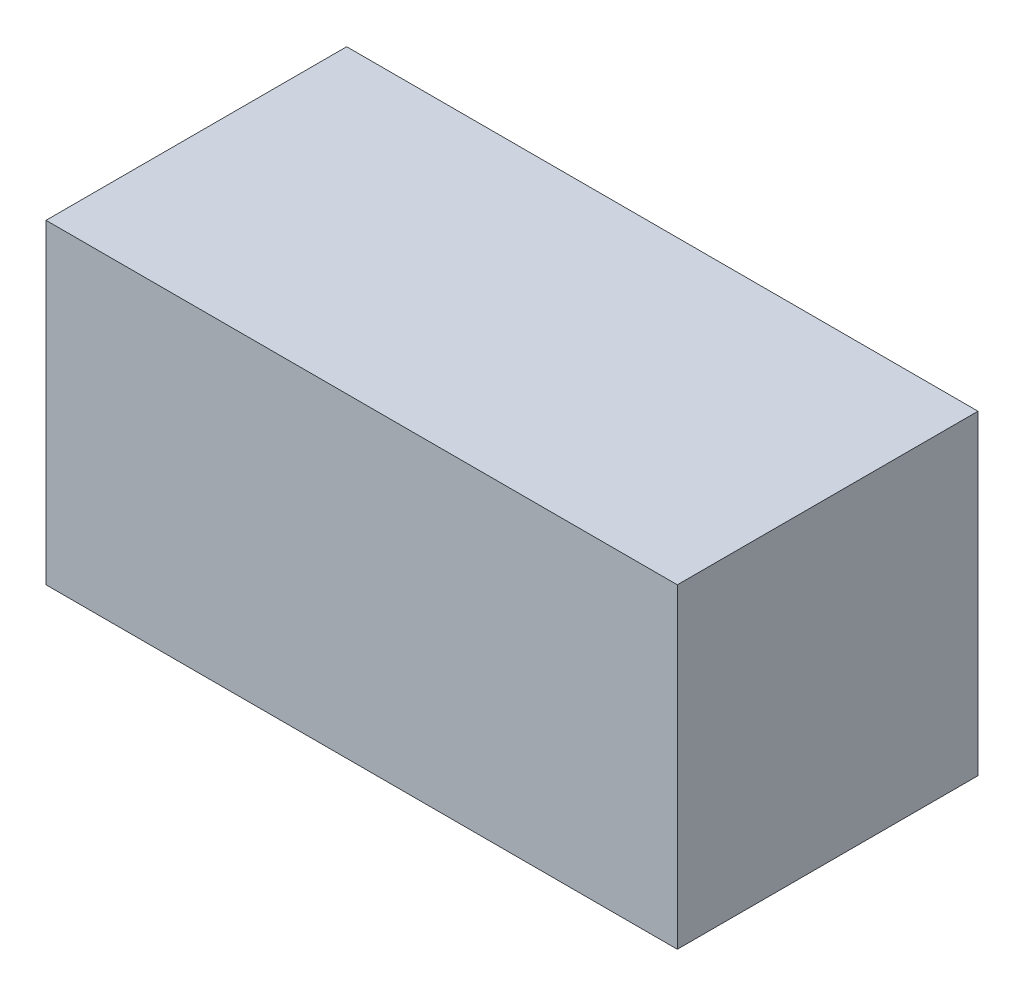
ISO-10303-21;
HEADER;
FILE_DESCRIPTION(('STEP AP214'),'2;1');
FILE_NAME('part.step','',(''),(''),'','','');
FILE_SCHEMA(('AUTOMOTIVE_DESIGN { 1 0 10303 214 1 1 1 1 }'));
ENDSEC;
DATA;
#1=APPLICATION_CONTEXT('core data for automotive mechanical design processes');
#2=APPLICATION_PROTOCOL_DEFINITION('international standard','automotive_design',2000,#1);
#3=PRODUCT_CONTEXT('',#1,'mechanical');
#4=PRODUCT('Part','Part','',(#3));
#5=PRODUCT_RELATED_PRODUCT_CATEGORY('part','',(#4));
#6=PRODUCT_DEFINITION_FORMATION('','',#4);
#7=PRODUCT_DEFINITION_CONTEXT('part definition',#1,'design');
#8=PRODUCT_DEFINITION('design','',#6,#7);
#9=PRODUCT_DEFINITION_SHAPE('','',#8);
#10=(LENGTH_UNIT() NAMED_UNIT(*) SI_UNIT(.MILLI.,.METRE.));
#11=(NAMED_UNIT(*) PLANE_ANGLE_UNIT() SI_UNIT($,.RADIAN.));
#12=(NAMED_UNIT(*) SI_UNIT($,.STERADIAN.) SOLID_ANGLE_UNIT());
#13=UNCERTAINTY_MEASURE_WITH_UNIT(LENGTH_MEASURE(1.E-05),#10,'distance_accuracy_value','');
#14=(GEOMETRIC_REPRESENTATION_CONTEXT(3) GLOBAL_UNCERTAINTY_ASSIGNED_CONTEXT((#13)) GLOBAL_UNIT_ASSIGNED_CONTEXT((#10,
#11,#12)) REPRESENTATION_CONTEXT('',''));
#15=CARTESIAN_POINT('',(0.,0.,0.));
#16=DIRECTION('',(0.,0.,1.));
#17=DIRECTION('',(1.,0.,0.));
#18=AXIS2_PLACEMENT_3D('',#15,#16,#17);
#19=CARTESIAN_POINT('',(0.799999999999998,0.4,0.762));
#20=DIRECTION('',(-1.,0.,0.));
#21=DIRECTION('',(0.,0.,1.));
#22=AXIS2_PLACEMENT_3D('',#19,#20,#21);
#23=PLANE('',#22);
#24=DIRECTION('',(0.,1.,0.));
#25=VECTOR('',#24,1.);
#26=CARTESIAN_POINT('',(0.799999999999998,0.4,0.));
#27=LINE('',#26,#25);
#28=CARTESIAN_POINT('',(0.799999999999998,-0.4,0.));
#29=VERTEX_POINT('',#28);
#30=CARTESIAN_POINT('',(0.799999999999998,0.4,0.));
#31=VERTEX_POINT('',#30);
#32=EDGE_CURVE('E96',#29,#31,#27,.T.);
#33=ORIENTED_EDGE('',*,*,#32,.T.);
#34=DIRECTION('',(0.,0.,-1.));
#35=VECTOR('',#34,1.);
#36=CARTESIAN_POINT('',(0.799999999999998,0.4,0.762));
#37=LINE('',#36,#35);
#38=CARTESIAN_POINT('',(0.799999999999998,0.4,0.762));
#39=VERTEX_POINT('',#38);
#40=EDGE_CURVE('E11',#39,#31,#37,.T.);
#41=ORIENTED_EDGE('',*,*,#40,.F.);
#42=DIRECTION('',(0.,1.,0.));
#43=VECTOR('',#42,1.);
#44=CARTESIAN_POINT('',(0.799999999999998,0.4,0.762));
#45=LINE('',#44,#43);
#46=CARTESIAN_POINT('',(0.799999999999998,-0.4,0.762));
#47=VERTEX_POINT('',#46);
#48=EDGE_CURVE('E84',#47,#39,#45,.T.);
#49=ORIENTED_EDGE('',*,*,#48,.F.);
#50=DIRECTION('',(0.,0.,-1.));
#51=VECTOR('',#50,1.);
#52=CARTESIAN_POINT('',(0.799999999999998,-0.4,0.762));
#53=LINE('',#52,#51);
#54=EDGE_CURVE('E92',#47,#29,#53,.T.);
#55=ORIENTED_EDGE('',*,*,#54,.T.);
#56=EDGE_LOOP('',(#33,#41,#49,#55));
#57=FACE_BOUND('',#56,.T.);
#58=ADVANCED_FACE('F33',(#57),#23,.F.);
#59=CARTESIAN_POINT('',(-0.800000000000002,0.399999999999999,0.762));
#60=DIRECTION('',(0.,-1.,0.));
#61=DIRECTION('',(1.,0.,0.));
#62=AXIS2_PLACEMENT_3D('',#59,#60,#61);
#63=PLANE('',#62);
#64=DIRECTION('',(-1.,0.,0.));
#65=VECTOR('',#64,1.);
#66=CARTESIAN_POINT('',(-0.800000000000002,0.399999999999999,0.));
#67=LINE('',#66,#65);
#68=CARTESIAN_POINT('',(-0.800000000000002,0.399999999999999,0.));
#69=VERTEX_POINT('',#68);
#70=EDGE_CURVE('E88',#31,#69,#67,.T.);
#71=ORIENTED_EDGE('',*,*,#70,.T.);
#72=DIRECTION('',(0.,0.,-1.));
#73=VECTOR('',#72,1.);
#74=CARTESIAN_POINT('',(-0.800000000000002,0.399999999999999,0.762));
#75=LINE('',#74,#73);
#76=CARTESIAN_POINT('',(-0.800000000000002,0.399999999999999,0.762));
#77=VERTEX_POINT('',#76);
#78=EDGE_CURVE('E41',#77,#69,#75,.T.);
#79=ORIENTED_EDGE('',*,*,#78,.F.);
#80=DIRECTION('',(-1.,0.,0.));
#81=VECTOR('',#80,1.);
#82=CARTESIAN_POINT('',(-0.800000000000002,0.399999999999999,0.762));
#83=LINE('',#82,#81);
#84=EDGE_CURVE('E79',#39,#77,#83,.T.);
#85=ORIENTED_EDGE('',*,*,#84,.F.);
#86=ORIENTED_EDGE('',*,*,#40,.T.);
#87=EDGE_LOOP('',(#71,#79,#85,#86));
#88=FACE_BOUND('',#87,.T.);
#89=ADVANCED_FACE('F87',(#88),#63,.F.);
#90=CARTESIAN_POINT('',(-0.800000000000002,0.399999999999999,0.762));
#91=DIRECTION('',(1.,0.,0.));
#92=DIRECTION('',(0.,0.,-1.));
#93=AXIS2_PLACEMENT_3D('',#90,#91,#92);
#94=PLANE('',#93);
#95=DIRECTION('',(0.,-1.,0.));
#96=VECTOR('',#95,1.);
#97=CARTESIAN_POINT('',(-0.800000000000002,0.399999999999999,0.));
#98=LINE('',#97,#96);
#99=CARTESIAN_POINT('',(-0.800000000000002,-0.4,0.));
#100=VERTEX_POINT('',#99);
#101=EDGE_CURVE('E66',#69,#100,#98,.T.);
#102=ORIENTED_EDGE('',*,*,#101,.T.);
#103=DIRECTION('',(0.,0.,-1.));
#104=VECTOR('',#103,1.);
#105=CARTESIAN_POINT('',(-0.800000000000002,-0.4,0.762));
#106=LINE('',#105,#104);
#107=CARTESIAN_POINT('',(-0.800000000000002,-0.4,0.762));
#108=VERTEX_POINT('',#107);
#109=EDGE_CURVE('E89',#108,#100,#106,.T.);
#110=ORIENTED_EDGE('',*,*,#109,.F.);
#111=DIRECTION('',(0.,-1.,0.));
#112=VECTOR('',#111,1.);
#113=CARTESIAN_POINT('',(-0.800000000000002,0.399999999999999,0.762));
#114=LINE('',#113,#112);
#115=EDGE_CURVE('E82',#77,#108,#114,.T.);
#116=ORIENTED_EDGE('',*,*,#115,.F.);
#117=ORIENTED_EDGE('',*,*,#78,.T.);
#118=EDGE_LOOP('',(#102,#110,#116,#117));
#119=FACE_BOUND('',#118,.T.);
#120=ADVANCED_FACE('F90',(#119),#94,.F.);
#121=CARTESIAN_POINT('',(-0.800000000000002,-0.4,0.762));
#122=DIRECTION('',(0.,1.,0.));
#123=DIRECTION('',(0.,0.,1.));
#124=AXIS2_PLACEMENT_3D('',#121,#122,#123);
#125=PLANE('',#124);
#126=DIRECTION('',(1.,0.,0.));
#127=VECTOR('',#126,1.);
#128=CARTESIAN_POINT('',(-0.800000000000002,-0.4,0.));
#129=LINE('',#128,#127);
#130=EDGE_CURVE('E72',#100,#29,#129,.T.);
#131=ORIENTED_EDGE('',*,*,#130,.T.);
#132=ORIENTED_EDGE('',*,*,#54,.F.);
#133=DIRECTION('',(1.,0.,0.));
#134=VECTOR('',#133,1.);
#135=CARTESIAN_POINT('',(-0.800000000000002,-0.4,0.762));
#136=LINE('',#135,#134);
#137=EDGE_CURVE('E49',#108,#47,#136,.T.);
#138=ORIENTED_EDGE('',*,*,#137,.F.);
#139=ORIENTED_EDGE('',*,*,#109,.T.);
#140=EDGE_LOOP('',(#131,#132,#138,#139));
#141=FACE_BOUND('',#140,.T.);
#142=ADVANCED_FACE('F103',(#141),#125,.F.);
#143=CARTESIAN_POINT('',(0.,0.,0.762));
#144=DIRECTION('',(0.,0.,1.));
#145=DIRECTION('',(1.,0.,0.));
#146=AXIS2_PLACEMENT_3D('',#143,#144,#145);
#147=PLANE('',#146);
#148=ORIENTED_EDGE('',*,*,#48,.T.);
#149=ORIENTED_EDGE('',*,*,#84,.T.);
#150=ORIENTED_EDGE('',*,*,#115,.T.);
#151=ORIENTED_EDGE('',*,*,#137,.T.);
#152=EDGE_LOOP('',(#148,#149,#150,#151));
#153=FACE_BOUND('',#152,.T.);
#154=ADVANCED_FACE('F80',(#153),#147,.T.);
#155=CARTESIAN_POINT('',(0.,0.,0.));
#156=DIRECTION('',(0.,0.,1.));
#157=DIRECTION('',(1.,0.,0.));
#158=AXIS2_PLACEMENT_3D('',#155,#156,#157);
#159=PLANE('',#158);
#160=ORIENTED_EDGE('',*,*,#32,.F.);
#161=ORIENTED_EDGE('',*,*,#130,.F.);
#162=ORIENTED_EDGE('',*,*,#101,.F.);
#163=ORIENTED_EDGE('',*,*,#70,.F.);
#164=EDGE_LOOP('',(#160,#161,#162,#163));
#165=FACE_BOUND('',#164,.T.);
#166=ADVANCED_FACE('F106',(#165),#159,.F.);
#167=CLOSED_SHELL('',(#58,#89,#120,#142,#154,#166));
#168=MANIFOLD_SOLID_BREP('B2',#167);
#169=ADVANCED_BREP_SHAPE_REPRESENTATION('',(#18,#168),#14);
#170=SHAPE_DEFINITION_REPRESENTATION(#9,#169);
ENDSEC;
END-ISO-10303-21;
